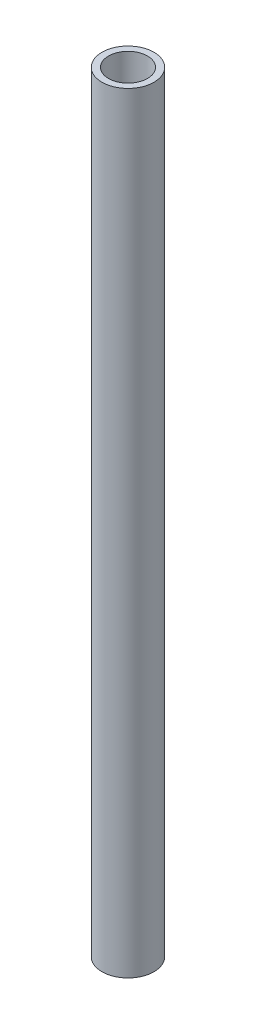
ISO-10303-21;
HEADER;
FILE_DESCRIPTION(('STEP AP214'),'2;1');
FILE_NAME('part.step','',(''),(''),'','','');
FILE_SCHEMA(('AUTOMOTIVE_DESIGN { 1 0 10303 214 1 1 1 1 }'));
ENDSEC;
DATA;
#1=APPLICATION_CONTEXT('core data for automotive mechanical design processes');
#2=APPLICATION_PROTOCOL_DEFINITION('international standard','automotive_design',2000,#1);
#3=PRODUCT_CONTEXT('',#1,'mechanical');
#4=PRODUCT('Part','Part','',(#3));
#5=PRODUCT_RELATED_PRODUCT_CATEGORY('part','',(#4));
#6=PRODUCT_DEFINITION_FORMATION('','',#4);
#7=PRODUCT_DEFINITION_CONTEXT('part definition',#1,'design');
#8=PRODUCT_DEFINITION('design','',#6,#7);
#9=PRODUCT_DEFINITION_SHAPE('','',#8);
#10=(LENGTH_UNIT() NAMED_UNIT(*) SI_UNIT(.MILLI.,.METRE.));
#11=(NAMED_UNIT(*) PLANE_ANGLE_UNIT() SI_UNIT($,.RADIAN.));
#12=(NAMED_UNIT(*) SI_UNIT($,.STERADIAN.) SOLID_ANGLE_UNIT());
#13=UNCERTAINTY_MEASURE_WITH_UNIT(LENGTH_MEASURE(1.E-05),#10,'distance_accuracy_value','');
#14=(GEOMETRIC_REPRESENTATION_CONTEXT(3) GLOBAL_UNCERTAINTY_ASSIGNED_CONTEXT((#13)) GLOBAL_UNIT_ASSIGNED_CONTEXT((#10,
#11,#12)) REPRESENTATION_CONTEXT('',''));
#15=CARTESIAN_POINT('',(0.,0.,0.));
#16=DIRECTION('',(0.,0.,1.));
#17=DIRECTION('',(1.,0.,0.));
#18=AXIS2_PLACEMENT_3D('',#15,#16,#17);
#19=CARTESIAN_POINT('',(0.,59.25775,0.));
#20=DIRECTION('',(0.,1.,0.));
#21=DIRECTION('',(0.,0.,1.));
#22=AXIS2_PLACEMENT_3D('',#19,#20,#21);
#23=PLANE('',#22);
#24=CARTESIAN_POINT('',(0.,59.25775,0.));
#25=DIRECTION('',(0.,1.,0.));
#26=DIRECTION('',(0.,0.,1.));
#27=AXIS2_PLACEMENT_3D('',#24,#25,#26);
#28=CIRCLE('',#27,4.);
#29=CARTESIAN_POINT('',(0.,59.25775,4.));
#30=VERTEX_POINT('',#29);
#31=EDGE_CURVE('E10',#30,#30,#28,.T.);
#32=ORIENTED_EDGE('',*,*,#31,.T.);
#33=EDGE_LOOP('',(#32));
#34=FACE_BOUND('',#33,.T.);
#35=CARTESIAN_POINT('',(0.,59.25775,0.));
#36=DIRECTION('',(0.,1.,0.));
#37=DIRECTION('',(0.,0.,1.));
#38=AXIS2_PLACEMENT_3D('',#35,#36,#37);
#39=CIRCLE('',#38,3.);
#40=CARTESIAN_POINT('',(0.,59.25775,3.));
#41=VERTEX_POINT('',#40);
#42=EDGE_CURVE('E58',#41,#41,#39,.T.);
#43=ORIENTED_EDGE('',*,*,#42,.F.);
#44=EDGE_LOOP('',(#43));
#45=FACE_BOUND('',#44,.T.);
#46=ADVANCED_FACE('F45',(#34,#45),#23,.T.);
#47=CARTESIAN_POINT('',(0.,-59.25775,0.));
#48=DIRECTION('',(0.,1.,0.));
#49=DIRECTION('',(0.,0.,1.));
#50=AXIS2_PLACEMENT_3D('',#47,#48,#49);
#51=PLANE('',#50);
#52=CARTESIAN_POINT('',(0.,-59.25775,0.));
#53=DIRECTION('',(0.,1.,0.));
#54=DIRECTION('',(0.,0.,1.));
#55=AXIS2_PLACEMENT_3D('',#52,#53,#54);
#56=CIRCLE('',#55,4.);
#57=CARTESIAN_POINT('',(0.,-59.25775,4.));
#58=VERTEX_POINT('',#57);
#59=EDGE_CURVE('E49',#58,#58,#56,.T.);
#60=ORIENTED_EDGE('',*,*,#59,.F.);
#61=EDGE_LOOP('',(#60));
#62=FACE_BOUND('',#61,.T.);
#63=CARTESIAN_POINT('',(0.,-59.25775,0.));
#64=DIRECTION('',(0.,1.,0.));
#65=DIRECTION('',(0.,0.,1.));
#66=AXIS2_PLACEMENT_3D('',#63,#64,#65);
#67=CIRCLE('',#66,3.);
#68=CARTESIAN_POINT('',(0.,-59.25775,3.));
#69=VERTEX_POINT('',#68);
#70=EDGE_CURVE('E60',#69,#69,#67,.T.);
#71=ORIENTED_EDGE('',*,*,#70,.T.);
#72=EDGE_LOOP('',(#71));
#73=FACE_BOUND('',#72,.T.);
#74=ADVANCED_FACE('F72',(#62,#73),#51,.F.);
#75=CARTESIAN_POINT('',(0.,59.25775,0.));
#76=DIRECTION('',(0.,-1.,0.));
#77=DIRECTION('',(0.,0.,-1.));
#78=AXIS2_PLACEMENT_3D('',#75,#76,#77);
#79=CYLINDRICAL_SURFACE('',#78,4.);
#80=ORIENTED_EDGE('',*,*,#31,.F.);
#81=EDGE_LOOP('',(#80));
#82=FACE_BOUND('',#81,.T.);
#83=ORIENTED_EDGE('',*,*,#59,.T.);
#84=EDGE_LOOP('',(#83));
#85=FACE_BOUND('',#84,.T.);
#86=ADVANCED_FACE('F47',(#82,#85),#79,.T.);
#87=CARTESIAN_POINT('',(0.,59.25775,0.));
#88=DIRECTION('',(0.,-1.,0.));
#89=DIRECTION('',(0.,0.,-1.));
#90=AXIS2_PLACEMENT_3D('',#87,#88,#89);
#91=CYLINDRICAL_SURFACE('',#90,3.);
#92=ORIENTED_EDGE('',*,*,#42,.T.);
#93=EDGE_LOOP('',(#92));
#94=FACE_BOUND('',#93,.T.);
#95=ORIENTED_EDGE('',*,*,#70,.F.);
#96=EDGE_LOOP('',(#95));
#97=FACE_BOUND('',#96,.T.);
#98=ADVANCED_FACE('F68',(#94,#97),#91,.F.);
#99=CLOSED_SHELL('',(#46,#74,#86,#98));
#100=MANIFOLD_SOLID_BREP('B2',#99);
#101=ADVANCED_BREP_SHAPE_REPRESENTATION('',(#18,#100),#14);
#102=SHAPE_DEFINITION_REPRESENTATION(#9,#101);
ENDSEC;
END-ISO-10303-21;
